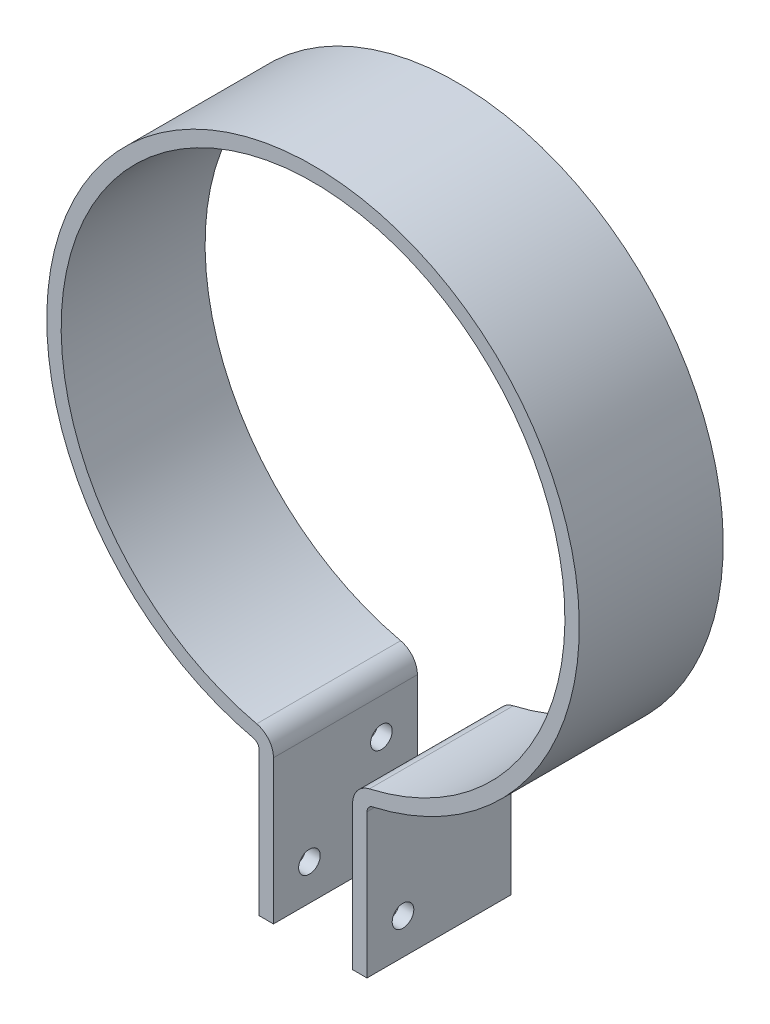
ISO-10303-21;
HEADER;
FILE_DESCRIPTION(('STEP AP214'),'2;1');
FILE_NAME('part.step','',(''),(''),'','','');
FILE_SCHEMA(('AUTOMOTIVE_DESIGN { 1 0 10303 214 1 1 1 1 }'));
ENDSEC;
DATA;
#1=APPLICATION_CONTEXT('core data for automotive mechanical design processes');
#2=APPLICATION_PROTOCOL_DEFINITION('international standard','automotive_design',2000,#1);
#3=PRODUCT_CONTEXT('',#1,'mechanical');
#4=PRODUCT('Part','Part','',(#3));
#5=PRODUCT_RELATED_PRODUCT_CATEGORY('part','',(#4));
#6=PRODUCT_DEFINITION_FORMATION('','',#4);
#7=PRODUCT_DEFINITION_CONTEXT('part definition',#1,'design');
#8=PRODUCT_DEFINITION('design','',#6,#7);
#9=PRODUCT_DEFINITION_SHAPE('','',#8);
#10=(LENGTH_UNIT() NAMED_UNIT(*) SI_UNIT(.MILLI.,.METRE.));
#11=(NAMED_UNIT(*) PLANE_ANGLE_UNIT() SI_UNIT($,.RADIAN.));
#12=(NAMED_UNIT(*) SI_UNIT($,.STERADIAN.) SOLID_ANGLE_UNIT());
#13=UNCERTAINTY_MEASURE_WITH_UNIT(LENGTH_MEASURE(1.E-05),#10,'distance_accuracy_value','');
#14=(GEOMETRIC_REPRESENTATION_CONTEXT(3) GLOBAL_UNCERTAINTY_ASSIGNED_CONTEXT((#13)) GLOBAL_UNIT_ASSIGNED_CONTEXT((#10,
#11,#12)) REPRESENTATION_CONTEXT('',''));
#15=CARTESIAN_POINT('',(0.,0.,0.));
#16=DIRECTION('',(0.,0.,1.));
#17=DIRECTION('',(1.,0.,0.));
#18=AXIS2_PLACEMENT_3D('',#15,#16,#17);
#19=CARTESIAN_POINT('',(-8.5,-37.0371435183654,20.));
#20=DIRECTION('',(0.,0.,-1.));
#21=DIRECTION('',(-1.,0.,0.));
#22=AXIS2_PLACEMENT_3D('',#19,#20,#21);
#23=CYLINDRICAL_SURFACE('',#22,1.);
#24=CARTESIAN_POINT('',(-8.5,-37.0371435183654,0.));
#25=DIRECTION('',(0.,0.,-1.));
#26=DIRECTION('',(1.,0.,0.));
#27=AXIS2_PLACEMENT_3D('',#24,#25,#26);
#28=CIRCLE('',#27,1.);
#29=CARTESIAN_POINT('',(-8.27631578947369,-36.0624818468295,0.));
#30=VERTEX_POINT('',#29);
#31=CARTESIAN_POINT('',(-7.5,-37.0371435183654,0.));
#32=VERTEX_POINT('',#31);
#33=EDGE_CURVE('E152',#30,#32,#28,.T.);
#34=ORIENTED_EDGE('',*,*,#33,.T.);
#35=DIRECTION('',(0.,0.,-1.));
#36=VECTOR('',#35,1.);
#37=CARTESIAN_POINT('',(-7.5,-37.0371435183654,20.));
#38=LINE('',#37,#36);
#39=CARTESIAN_POINT('',(-7.5,-37.0371435183654,20.));
#40=VERTEX_POINT('',#39);
#41=EDGE_CURVE('E11',#40,#32,#38,.T.);
#42=ORIENTED_EDGE('',*,*,#41,.F.);
#43=CARTESIAN_POINT('',(-8.5,-37.0371435183654,20.));
#44=DIRECTION('',(0.,0.,-1.));
#45=DIRECTION('',(1.,0.,0.));
#46=AXIS2_PLACEMENT_3D('',#43,#44,#45);
#47=CIRCLE('',#46,1.);
#48=CARTESIAN_POINT('',(-8.27631578947369,-36.0624818468295,20.));
#49=VERTEX_POINT('',#48);
#50=EDGE_CURVE('E175',#49,#40,#47,.T.);
#51=ORIENTED_EDGE('',*,*,#50,.F.);
#52=DIRECTION('',(0.,0.,-1.));
#53=VECTOR('',#52,1.);
#54=CARTESIAN_POINT('',(-8.27631578947369,-36.0624818468295,20.));
#55=LINE('',#54,#53);
#56=EDGE_CURVE('E148',#49,#30,#55,.T.);
#57=ORIENTED_EDGE('',*,*,#56,.T.);
#58=EDGE_LOOP('',(#34,#42,#51,#57));
#59=FACE_BOUND('',#58,.T.);
#60=ADVANCED_FACE('F30',(#59),#23,.F.);
#61=CARTESIAN_POINT('',(-7.5,-57.0371435183655,20.));
#62=DIRECTION('',(1.,0.,0.));
#63=DIRECTION('',(0.,0.,-1.));
#64=AXIS2_PLACEMENT_3D('',#61,#62,#63);
#65=PLANE('',#64);
#66=CARTESIAN_POINT('',(-7.5,-42.0371435183655,5.));
#67=DIRECTION('',(-1.,0.,0.));
#68=DIRECTION('',(0.,0.,1.));
#69=AXIS2_PLACEMENT_3D('',#66,#67,#68);
#70=CIRCLE('',#69,1.5);
#71=CARTESIAN_POINT('',(-7.5,-42.0371435183655,6.5));
#72=VERTEX_POINT('',#71);
#73=EDGE_CURVE('E303',#72,#72,#70,.T.);
#74=ORIENTED_EDGE('',*,*,#73,.F.);
#75=EDGE_LOOP('',(#74));
#76=FACE_BOUND('',#75,.T.);
#77=CARTESIAN_POINT('',(-7.5,-52.0371435183655,15.));
#78=DIRECTION('',(-1.,0.,0.));
#79=DIRECTION('',(0.,0.,1.));
#80=AXIS2_PLACEMENT_3D('',#77,#78,#79);
#81=CIRCLE('',#80,1.5);
#82=CARTESIAN_POINT('',(-7.5,-52.0371435183655,16.5));
#83=VERTEX_POINT('',#82);
#84=EDGE_CURVE('E201',#83,#83,#81,.T.);
#85=ORIENTED_EDGE('',*,*,#84,.F.);
#86=EDGE_LOOP('',(#85));
#87=FACE_BOUND('',#86,.T.);
#88=DIRECTION('',(0.,-1.,0.));
#89=VECTOR('',#88,1.);
#90=CARTESIAN_POINT('',(-7.5,-57.0371435183655,0.));
#91=LINE('',#90,#89);
#92=CARTESIAN_POINT('',(-7.5,-57.0371435183655,0.));
#93=VERTEX_POINT('',#92);
#94=EDGE_CURVE('E155',#32,#93,#91,.T.);
#95=ORIENTED_EDGE('',*,*,#94,.T.);
#96=DIRECTION('',(0.,0.,-1.));
#97=VECTOR('',#96,1.);
#98=CARTESIAN_POINT('',(-7.5,-57.0371435183655,20.));
#99=LINE('',#98,#97);
#100=CARTESIAN_POINT('',(-7.5,-57.0371435183655,20.));
#101=VERTEX_POINT('',#100);
#102=EDGE_CURVE('E39',#101,#93,#99,.T.);
#103=ORIENTED_EDGE('',*,*,#102,.F.);
#104=DIRECTION('',(0.,-1.,0.));
#105=VECTOR('',#104,1.);
#106=CARTESIAN_POINT('',(-7.5,-57.0371435183655,20.));
#107=LINE('',#106,#105);
#108=EDGE_CURVE('E103',#40,#101,#107,.T.);
#109=ORIENTED_EDGE('',*,*,#108,.F.);
#110=ORIENTED_EDGE('',*,*,#41,.T.);
#111=EDGE_LOOP('',(#95,#103,#109,#110));
#112=FACE_BOUND('',#111,.T.);
#113=ADVANCED_FACE('F259',(#76,#87,#112),#65,.F.);
#114=CARTESIAN_POINT('',(-7.5,-57.0371435183655,20.));
#115=DIRECTION('',(0.,1.,0.));
#116=DIRECTION('',(-1.,0.,0.));
#117=AXIS2_PLACEMENT_3D('',#114,#115,#116);
#118=PLANE('',#117);
#119=DIRECTION('',(1.,0.,0.));
#120=VECTOR('',#119,1.);
#121=CARTESIAN_POINT('',(-7.5,-57.0371435183655,0.));
#122=LINE('',#121,#120);
#123=CARTESIAN_POINT('',(-5.5,-57.0371435183654,0.));
#124=VERTEX_POINT('',#123);
#125=EDGE_CURVE('E158',#93,#124,#122,.T.);
#126=ORIENTED_EDGE('',*,*,#125,.T.);
#127=DIRECTION('',(0.,0.,-1.));
#128=VECTOR('',#127,1.);
#129=CARTESIAN_POINT('',(-5.5,-57.0371435183654,20.));
#130=LINE('',#129,#128);
#131=CARTESIAN_POINT('',(-5.5,-57.0371435183654,20.));
#132=VERTEX_POINT('',#131);
#133=EDGE_CURVE('E194',#132,#124,#130,.T.);
#134=ORIENTED_EDGE('',*,*,#133,.F.);
#135=DIRECTION('',(1.,0.,0.));
#136=VECTOR('',#135,1.);
#137=CARTESIAN_POINT('',(-7.5,-57.0371435183655,20.));
#138=LINE('',#137,#136);
#139=EDGE_CURVE('E220',#101,#132,#138,.T.);
#140=ORIENTED_EDGE('',*,*,#139,.F.);
#141=ORIENTED_EDGE('',*,*,#102,.T.);
#142=EDGE_LOOP('',(#126,#134,#140,#141));
#143=FACE_BOUND('',#142,.T.);
#144=ADVANCED_FACE('F264',(#143),#118,.F.);
#145=CARTESIAN_POINT('',(-5.5,-57.0371435183654,20.));
#146=DIRECTION('',(-1.,0.,0.));
#147=DIRECTION('',(0.,0.,1.));
#148=AXIS2_PLACEMENT_3D('',#145,#146,#147);
#149=PLANE('',#148);
#150=CARTESIAN_POINT('',(-5.5,-42.0371435183655,5.));
#151=DIRECTION('',(-1.,0.,0.));
#152=DIRECTION('',(0.,0.,1.));
#153=AXIS2_PLACEMENT_3D('',#150,#151,#152);
#154=CIRCLE('',#153,1.5);
#155=CARTESIAN_POINT('',(-5.5,-42.0371435183655,6.5));
#156=VERTEX_POINT('',#155);
#157=EDGE_CURVE('E207',#156,#156,#154,.T.);
#158=ORIENTED_EDGE('',*,*,#157,.T.);
#159=EDGE_LOOP('',(#158));
#160=FACE_BOUND('',#159,.T.);
#161=CARTESIAN_POINT('',(-5.5,-52.0371435183655,15.));
#162=DIRECTION('',(-1.,0.,0.));
#163=DIRECTION('',(0.,0.,1.));
#164=AXIS2_PLACEMENT_3D('',#161,#162,#163);
#165=CIRCLE('',#164,1.5);
#166=CARTESIAN_POINT('',(-5.5,-52.0371435183655,16.5));
#167=VERTEX_POINT('',#166);
#168=EDGE_CURVE('E156',#167,#167,#165,.T.);
#169=ORIENTED_EDGE('',*,*,#168,.T.);
#170=EDGE_LOOP('',(#169));
#171=FACE_BOUND('',#170,.T.);
#172=DIRECTION('',(0.,1.,0.));
#173=VECTOR('',#172,1.);
#174=CARTESIAN_POINT('',(-5.5,-57.0371435183654,0.));
#175=LINE('',#174,#173);
#176=CARTESIAN_POINT('',(-5.5,-37.0371435183654,0.));
#177=VERTEX_POINT('',#176);
#178=EDGE_CURVE('E160',#124,#177,#175,.T.);
#179=ORIENTED_EDGE('',*,*,#178,.T.);
#180=DIRECTION('',(0.,0.,-1.));
#181=VECTOR('',#180,1.);
#182=CARTESIAN_POINT('',(-5.5,-37.0371435183654,20.));
#183=LINE('',#182,#181);
#184=CARTESIAN_POINT('',(-5.5,-37.0371435183654,20.));
#185=VERTEX_POINT('',#184);
#186=EDGE_CURVE('E191',#185,#177,#183,.T.);
#187=ORIENTED_EDGE('',*,*,#186,.F.);
#188=DIRECTION('',(0.,1.,0.));
#189=VECTOR('',#188,1.);
#190=CARTESIAN_POINT('',(-5.5,-57.0371435183654,20.));
#191=LINE('',#190,#189);
#192=EDGE_CURVE('E222',#132,#185,#191,.T.);
#193=ORIENTED_EDGE('',*,*,#192,.F.);
#194=ORIENTED_EDGE('',*,*,#133,.T.);
#195=EDGE_LOOP('',(#179,#187,#193,#194));
#196=FACE_BOUND('',#195,.T.);
#197=ADVANCED_FACE('F270',(#160,#171,#196),#149,.F.);
#198=CARTESIAN_POINT('',(-8.5,-37.0371435183654,20.));
#199=DIRECTION('',(0.,0.,-1.));
#200=DIRECTION('',(-1.,0.,0.));
#201=AXIS2_PLACEMENT_3D('',#198,#199,#200);
#202=CYLINDRICAL_SURFACE('',#201,2.99999999999999);
#203=CARTESIAN_POINT('',(-8.5,-37.0371435183654,0.));
#204=DIRECTION('',(0.,0.,1.));
#205=DIRECTION('',(1.,0.,0.));
#206=AXIS2_PLACEMENT_3D('',#203,#204,#205);
#207=CIRCLE('',#206,2.99999999999999);
#208=CARTESIAN_POINT('',(-7.82894736842105,-34.1131585037577,0.));
#209=VERTEX_POINT('',#208);
#210=EDGE_CURVE('E162',#177,#209,#207,.T.);
#211=ORIENTED_EDGE('',*,*,#210,.T.);
#212=DIRECTION('',(0.,0.,-1.));
#213=VECTOR('',#212,1.);
#214=CARTESIAN_POINT('',(-7.82894736842105,-34.1131585037577,20.));
#215=LINE('',#214,#213);
#216=CARTESIAN_POINT('',(-7.82894736842105,-34.1131585037577,20.));
#217=VERTEX_POINT('',#216);
#218=EDGE_CURVE('E188',#217,#209,#215,.T.);
#219=ORIENTED_EDGE('',*,*,#218,.F.);
#220=CARTESIAN_POINT('',(-8.5,-37.0371435183654,20.));
#221=DIRECTION('',(0.,0.,1.));
#222=DIRECTION('',(1.,0.,0.));
#223=AXIS2_PLACEMENT_3D('',#220,#221,#222);
#224=CIRCLE('',#223,2.99999999999999);
#225=EDGE_CURVE('E224',#185,#217,#224,.T.);
#226=ORIENTED_EDGE('',*,*,#225,.F.);
#227=ORIENTED_EDGE('',*,*,#186,.T.);
#228=EDGE_LOOP('',(#211,#219,#226,#227));
#229=FACE_BOUND('',#228,.T.);
#230=ADVANCED_FACE('F277',(#229),#202,.T.);
#231=CARTESIAN_POINT('',(0.,0.,20.));
#232=DIRECTION('',(0.,0.,-1.));
#233=DIRECTION('',(-1.,0.,0.));
#234=AXIS2_PLACEMENT_3D('',#231,#232,#233);
#235=CYLINDRICAL_SURFACE('',#234,35.);
#236=CARTESIAN_POINT('',(0.,0.,0.));
#237=DIRECTION('',(0.,0.,-1.));
#238=DIRECTION('',(1.,0.,0.));
#239=AXIS2_PLACEMENT_3D('',#236,#237,#238);
#240=CIRCLE('',#239,35.);
#241=CARTESIAN_POINT('',(7.82894736842105,-34.1131585037577,0.));
#242=VERTEX_POINT('',#241);
#243=EDGE_CURVE('E164',#209,#242,#240,.T.);
#244=ORIENTED_EDGE('',*,*,#243,.T.);
#245=DIRECTION('',(0.,0.,-1.));
#246=VECTOR('',#245,1.);
#247=CARTESIAN_POINT('',(7.82894736842105,-34.1131585037577,20.));
#248=LINE('',#247,#246);
#249=CARTESIAN_POINT('',(7.82894736842105,-34.1131585037577,20.));
#250=VERTEX_POINT('',#249);
#251=EDGE_CURVE('E185',#250,#242,#248,.T.);
#252=ORIENTED_EDGE('',*,*,#251,.F.);
#253=CARTESIAN_POINT('',(0.,0.,20.));
#254=DIRECTION('',(0.,0.,-1.));
#255=DIRECTION('',(1.,0.,0.));
#256=AXIS2_PLACEMENT_3D('',#253,#254,#255);
#257=CIRCLE('',#256,35.);
#258=EDGE_CURVE('E226',#217,#250,#257,.T.);
#259=ORIENTED_EDGE('',*,*,#258,.F.);
#260=ORIENTED_EDGE('',*,*,#218,.T.);
#261=EDGE_LOOP('',(#244,#252,#259,#260));
#262=FACE_BOUND('',#261,.T.);
#263=ADVANCED_FACE('F281',(#262),#235,.F.);
#264=CARTESIAN_POINT('',(8.5,-37.0371435183654,20.));
#265=DIRECTION('',(0.,0.,-1.));
#266=DIRECTION('',(-1.,0.,0.));
#267=AXIS2_PLACEMENT_3D('',#264,#265,#266);
#268=CYLINDRICAL_SURFACE('',#267,3.);
#269=CARTESIAN_POINT('',(8.5,-37.0371435183654,0.));
#270=DIRECTION('',(0.,0.,1.));
#271=DIRECTION('',(1.,0.,0.));
#272=AXIS2_PLACEMENT_3D('',#269,#270,#271);
#273=CIRCLE('',#272,3.);
#274=CARTESIAN_POINT('',(5.5,-37.0371435183654,0.));
#275=VERTEX_POINT('',#274);
#276=EDGE_CURVE('E166',#242,#275,#273,.T.);
#277=ORIENTED_EDGE('',*,*,#276,.T.);
#278=DIRECTION('',(0.,0.,-1.));
#279=VECTOR('',#278,1.);
#280=CARTESIAN_POINT('',(5.5,-37.0371435183654,20.));
#281=LINE('',#280,#279);
#282=CARTESIAN_POINT('',(5.5,-37.0371435183654,20.));
#283=VERTEX_POINT('',#282);
#284=EDGE_CURVE('E182',#283,#275,#281,.T.);
#285=ORIENTED_EDGE('',*,*,#284,.F.);
#286=CARTESIAN_POINT('',(8.5,-37.0371435183654,20.));
#287=DIRECTION('',(0.,0.,1.));
#288=DIRECTION('',(1.,0.,0.));
#289=AXIS2_PLACEMENT_3D('',#286,#287,#288);
#290=CIRCLE('',#289,3.);
#291=EDGE_CURVE('E228',#250,#283,#290,.T.);
#292=ORIENTED_EDGE('',*,*,#291,.F.);
#293=ORIENTED_EDGE('',*,*,#251,.T.);
#294=EDGE_LOOP('',(#277,#285,#292,#293));
#295=FACE_BOUND('',#294,.T.);
#296=ADVANCED_FACE('F285',(#295),#268,.T.);
#297=CARTESIAN_POINT('',(5.5,-57.0371435183654,20.));
#298=DIRECTION('',(1.,0.,0.));
#299=DIRECTION('',(0.,1.,0.));
#300=AXIS2_PLACEMENT_3D('',#297,#298,#299);
#301=PLANE('',#300);
#302=CARTESIAN_POINT('',(5.5,-42.0371435183655,5.));
#303=DIRECTION('',(1.,0.,0.));
#304=DIRECTION('',(0.,1.,0.));
#305=AXIS2_PLACEMENT_3D('',#302,#303,#304);
#306=CIRCLE('',#305,1.5);
#307=CARTESIAN_POINT('',(5.5,-40.5371435183655,5.));
#308=VERTEX_POINT('',#307);
#309=EDGE_CURVE('E212',#308,#308,#306,.T.);
#310=ORIENTED_EDGE('',*,*,#309,.T.);
#311=EDGE_LOOP('',(#310));
#312=FACE_BOUND('',#311,.T.);
#313=CARTESIAN_POINT('',(5.5,-52.0371435183655,15.));
#314=DIRECTION('',(1.,0.,0.));
#315=DIRECTION('',(0.,1.,0.));
#316=AXIS2_PLACEMENT_3D('',#313,#314,#315);
#317=CIRCLE('',#316,1.5);
#318=CARTESIAN_POINT('',(5.5,-50.5371435183655,15.));
#319=VERTEX_POINT('',#318);
#320=EDGE_CURVE('E200',#319,#319,#317,.T.);
#321=ORIENTED_EDGE('',*,*,#320,.T.);
#322=EDGE_LOOP('',(#321));
#323=FACE_BOUND('',#322,.T.);
#324=DIRECTION('',(0.,-1.,0.));
#325=VECTOR('',#324,1.);
#326=CARTESIAN_POINT('',(5.5,-57.0371435183654,0.));
#327=LINE('',#326,#325);
#328=CARTESIAN_POINT('',(5.5,-57.0371435183654,0.));
#329=VERTEX_POINT('',#328);
#330=EDGE_CURVE('E168',#275,#329,#327,.T.);
#331=ORIENTED_EDGE('',*,*,#330,.T.);
#332=DIRECTION('',(0.,0.,-1.));
#333=VECTOR('',#332,1.);
#334=CARTESIAN_POINT('',(5.5,-57.0371435183654,20.));
#335=LINE('',#334,#333);
#336=CARTESIAN_POINT('',(5.5,-57.0371435183654,20.));
#337=VERTEX_POINT('',#336);
#338=EDGE_CURVE('E179',#337,#329,#335,.T.);
#339=ORIENTED_EDGE('',*,*,#338,.F.);
#340=DIRECTION('',(0.,-1.,0.));
#341=VECTOR('',#340,1.);
#342=CARTESIAN_POINT('',(5.5,-57.0371435183654,20.));
#343=LINE('',#342,#341);
#344=EDGE_CURVE('E230',#283,#337,#343,.T.);
#345=ORIENTED_EDGE('',*,*,#344,.F.);
#346=ORIENTED_EDGE('',*,*,#284,.T.);
#347=EDGE_LOOP('',(#331,#339,#345,#346));
#348=FACE_BOUND('',#347,.T.);
#349=ADVANCED_FACE('F236',(#312,#323,#348),#301,.F.);
#350=CARTESIAN_POINT('',(5.5,-57.0371435183654,20.));
#351=DIRECTION('',(0.,1.,0.));
#352=DIRECTION('',(-1.,0.,0.));
#353=AXIS2_PLACEMENT_3D('',#350,#351,#352);
#354=PLANE('',#353);
#355=DIRECTION('',(1.,0.,0.));
#356=VECTOR('',#355,1.);
#357=CARTESIAN_POINT('',(5.5,-57.0371435183654,0.));
#358=LINE('',#357,#356);
#359=CARTESIAN_POINT('',(7.5,-57.0371435183655,0.));
#360=VERTEX_POINT('',#359);
#361=EDGE_CURVE('E170',#329,#360,#358,.T.);
#362=ORIENTED_EDGE('',*,*,#361,.T.);
#363=DIRECTION('',(0.,0.,-1.));
#364=VECTOR('',#363,1.);
#365=CARTESIAN_POINT('',(7.5,-57.0371435183655,20.));
#366=LINE('',#365,#364);
#367=CARTESIAN_POINT('',(7.5,-57.0371435183655,20.));
#368=VERTEX_POINT('',#367);
#369=EDGE_CURVE('E143',#368,#360,#366,.T.);
#370=ORIENTED_EDGE('',*,*,#369,.F.);
#371=DIRECTION('',(1.,0.,0.));
#372=VECTOR('',#371,1.);
#373=CARTESIAN_POINT('',(5.5,-57.0371435183654,20.));
#374=LINE('',#373,#372);
#375=EDGE_CURVE('E134',#337,#368,#374,.T.);
#376=ORIENTED_EDGE('',*,*,#375,.F.);
#377=ORIENTED_EDGE('',*,*,#338,.T.);
#378=EDGE_LOOP('',(#362,#370,#376,#377));
#379=FACE_BOUND('',#378,.T.);
#380=ADVANCED_FACE('F240',(#379),#354,.F.);
#381=CARTESIAN_POINT('',(7.5,-57.0371435183655,20.));
#382=DIRECTION('',(-1.,0.,0.));
#383=DIRECTION('',(0.,0.,1.));
#384=AXIS2_PLACEMENT_3D('',#381,#382,#383);
#385=PLANE('',#384);
#386=CARTESIAN_POINT('',(7.5,-42.0371435183655,5.));
#387=DIRECTION('',(-1.,0.,0.));
#388=DIRECTION('',(0.,0.,1.));
#389=AXIS2_PLACEMENT_3D('',#386,#387,#388);
#390=CIRCLE('',#389,1.5);
#391=CARTESIAN_POINT('',(7.5,-42.0371435183655,6.5));
#392=VERTEX_POINT('',#391);
#393=EDGE_CURVE('E33',#392,#392,#390,.T.);
#394=ORIENTED_EDGE('',*,*,#393,.T.);
#395=EDGE_LOOP('',(#394));
#396=FACE_BOUND('',#395,.T.);
#397=CARTESIAN_POINT('',(7.5,-52.0371435183655,15.));
#398=DIRECTION('',(-1.,0.,0.));
#399=DIRECTION('',(0.,0.,1.));
#400=AXIS2_PLACEMENT_3D('',#397,#398,#399);
#401=CIRCLE('',#400,1.5);
#402=CARTESIAN_POINT('',(7.5,-52.0371435183655,16.5));
#403=VERTEX_POINT('',#402);
#404=EDGE_CURVE('E198',#403,#403,#401,.T.);
#405=ORIENTED_EDGE('',*,*,#404,.T.);
#406=EDGE_LOOP('',(#405));
#407=FACE_BOUND('',#406,.T.);
#408=DIRECTION('',(0.,1.,0.));
#409=VECTOR('',#408,1.);
#410=CARTESIAN_POINT('',(7.5,-57.0371435183655,0.));
#411=LINE('',#410,#409);
#412=CARTESIAN_POINT('',(7.5,-37.0371435183655,0.));
#413=VERTEX_POINT('',#412);
#414=EDGE_CURVE('E142',#360,#413,#411,.T.);
#415=ORIENTED_EDGE('',*,*,#414,.T.);
#416=DIRECTION('',(0.,0.,-1.));
#417=VECTOR('',#416,1.);
#418=CARTESIAN_POINT('',(7.5,-37.0371435183655,20.));
#419=LINE('',#418,#417);
#420=CARTESIAN_POINT('',(7.5,-37.0371435183655,20.));
#421=VERTEX_POINT('',#420);
#422=EDGE_CURVE('E139',#421,#413,#419,.T.);
#423=ORIENTED_EDGE('',*,*,#422,.F.);
#424=DIRECTION('',(0.,1.,0.));
#425=VECTOR('',#424,1.);
#426=CARTESIAN_POINT('',(7.5,-57.0371435183655,20.));
#427=LINE('',#426,#425);
#428=EDGE_CURVE('E128',#368,#421,#427,.T.);
#429=ORIENTED_EDGE('',*,*,#428,.F.);
#430=ORIENTED_EDGE('',*,*,#369,.T.);
#431=EDGE_LOOP('',(#415,#423,#429,#430));
#432=FACE_BOUND('',#431,.T.);
#433=ADVANCED_FACE('F140',(#396,#407,#432),#385,.F.);
#434=CARTESIAN_POINT('',(8.5,-37.0371435183655,20.));
#435=DIRECTION('',(0.,0.,-1.));
#436=DIRECTION('',(-1.,0.,0.));
#437=AXIS2_PLACEMENT_3D('',#434,#435,#436);
#438=CYLINDRICAL_SURFACE('',#437,1.00000000000001);
#439=CARTESIAN_POINT('',(8.5,-37.0371435183655,0.));
#440=DIRECTION('',(0.,0.,-1.));
#441=DIRECTION('',(1.,0.,0.));
#442=AXIS2_PLACEMENT_3D('',#439,#440,#441);
#443=CIRCLE('',#442,1.00000000000001);
#444=CARTESIAN_POINT('',(8.27631578947368,-36.0624818468295,0.));
#445=VERTEX_POINT('',#444);
#446=EDGE_CURVE('E89',#413,#445,#443,.T.);
#447=ORIENTED_EDGE('',*,*,#446,.T.);
#448=DIRECTION('',(0.,0.,-1.));
#449=VECTOR('',#448,1.);
#450=CARTESIAN_POINT('',(8.27631578947368,-36.0624818468295,20.));
#451=LINE('',#450,#449);
#452=CARTESIAN_POINT('',(8.27631578947368,-36.0624818468295,20.));
#453=VERTEX_POINT('',#452);
#454=EDGE_CURVE('E144',#453,#445,#451,.T.);
#455=ORIENTED_EDGE('',*,*,#454,.F.);
#456=CARTESIAN_POINT('',(8.5,-37.0371435183655,20.));
#457=DIRECTION('',(0.,0.,-1.));
#458=DIRECTION('',(1.,0.,0.));
#459=AXIS2_PLACEMENT_3D('',#456,#457,#458);
#460=CIRCLE('',#459,1.00000000000001);
#461=EDGE_CURVE('E132',#421,#453,#460,.T.);
#462=ORIENTED_EDGE('',*,*,#461,.F.);
#463=ORIENTED_EDGE('',*,*,#422,.T.);
#464=EDGE_LOOP('',(#447,#455,#462,#463));
#465=FACE_BOUND('',#464,.T.);
#466=ADVANCED_FACE('F146',(#465),#438,.F.);
#467=CARTESIAN_POINT('',(0.,0.,20.));
#468=DIRECTION('',(0.,0.,-1.));
#469=DIRECTION('',(-1.,0.,0.));
#470=AXIS2_PLACEMENT_3D('',#467,#468,#469);
#471=CYLINDRICAL_SURFACE('',#470,37.);
#472=CARTESIAN_POINT('',(0.,0.,0.));
#473=DIRECTION('',(0.,0.,1.));
#474=DIRECTION('',(1.,0.,0.));
#475=AXIS2_PLACEMENT_3D('',#472,#473,#474);
#476=CIRCLE('',#475,37.);
#477=EDGE_CURVE('E95',#445,#30,#476,.T.);
#478=ORIENTED_EDGE('',*,*,#477,.T.);
#479=ORIENTED_EDGE('',*,*,#56,.F.);
#480=CARTESIAN_POINT('',(0.,0.,20.));
#481=DIRECTION('',(0.,0.,1.));
#482=DIRECTION('',(1.,0.,0.));
#483=AXIS2_PLACEMENT_3D('',#480,#481,#482);
#484=CIRCLE('',#483,37.);
#485=EDGE_CURVE('E48',#453,#49,#484,.T.);
#486=ORIENTED_EDGE('',*,*,#485,.F.);
#487=ORIENTED_EDGE('',*,*,#454,.T.);
#488=EDGE_LOOP('',(#478,#479,#486,#487));
#489=FACE_BOUND('',#488,.T.);
#490=ADVANCED_FACE('F248',(#489),#471,.T.);
#491=CARTESIAN_POINT('',(-8.5,-37.0371435183654,20.));
#492=DIRECTION('',(0.,0.,1.));
#493=DIRECTION('',(1.,0.,0.));
#494=AXIS2_PLACEMENT_3D('',#491,#492,#493);
#495=PLANE('',#494);
#496=ORIENTED_EDGE('',*,*,#50,.T.);
#497=ORIENTED_EDGE('',*,*,#108,.T.);
#498=ORIENTED_EDGE('',*,*,#139,.T.);
#499=ORIENTED_EDGE('',*,*,#192,.T.);
#500=ORIENTED_EDGE('',*,*,#225,.T.);
#501=ORIENTED_EDGE('',*,*,#258,.T.);
#502=ORIENTED_EDGE('',*,*,#291,.T.);
#503=ORIENTED_EDGE('',*,*,#344,.T.);
#504=ORIENTED_EDGE('',*,*,#375,.T.);
#505=ORIENTED_EDGE('',*,*,#428,.T.);
#506=ORIENTED_EDGE('',*,*,#461,.T.);
#507=ORIENTED_EDGE('',*,*,#485,.T.);
#508=EDGE_LOOP('',(#496,#497,#498,#499,#500,#501,#502,#503,#504,#505,#506,#507));
#509=FACE_BOUND('',#508,.T.);
#510=ADVANCED_FACE('F130',(#509),#495,.T.);
#511=CARTESIAN_POINT('',(-8.5,-37.0371435183654,0.));
#512=DIRECTION('',(0.,0.,1.));
#513=DIRECTION('',(1.,0.,0.));
#514=AXIS2_PLACEMENT_3D('',#511,#512,#513);
#515=PLANE('',#514);
#516=ORIENTED_EDGE('',*,*,#33,.F.);
#517=ORIENTED_EDGE('',*,*,#477,.F.);
#518=ORIENTED_EDGE('',*,*,#446,.F.);
#519=ORIENTED_EDGE('',*,*,#414,.F.);
#520=ORIENTED_EDGE('',*,*,#361,.F.);
#521=ORIENTED_EDGE('',*,*,#330,.F.);
#522=ORIENTED_EDGE('',*,*,#276,.F.);
#523=ORIENTED_EDGE('',*,*,#243,.F.);
#524=ORIENTED_EDGE('',*,*,#210,.F.);
#525=ORIENTED_EDGE('',*,*,#178,.F.);
#526=ORIENTED_EDGE('',*,*,#125,.F.);
#527=ORIENTED_EDGE('',*,*,#94,.F.);
#528=EDGE_LOOP('',(#516,#517,#518,#519,#520,#521,#522,#523,#524,#525,#526,#527));
#529=FACE_BOUND('',#528,.T.);
#530=ADVANCED_FACE('F243',(#529),#515,.F.);
#531=CARTESIAN_POINT('',(37.,-52.0371435183655,15.));
#532=DIRECTION('',(-1.,0.,0.));
#533=DIRECTION('',(0.,0.,1.));
#534=AXIS2_PLACEMENT_3D('',#531,#532,#533);
#535=CYLINDRICAL_SURFACE('',#534,1.5);
#536=ORIENTED_EDGE('',*,*,#404,.F.);
#537=EDGE_LOOP('',(#536));
#538=FACE_BOUND('',#537,.T.);
#539=ORIENTED_EDGE('',*,*,#320,.F.);
#540=EDGE_LOOP('',(#539));
#541=FACE_BOUND('',#540,.T.);
#542=ADVANCED_FACE('F332',(#538,#541),#535,.F.);
#543=ORIENTED_EDGE('',*,*,#84,.T.);
#544=EDGE_LOOP('',(#543));
#545=FACE_BOUND('',#544,.T.);
#546=ORIENTED_EDGE('',*,*,#168,.F.);
#547=EDGE_LOOP('',(#546));
#548=FACE_BOUND('',#547,.T.);
#549=ADVANCED_FACE('F330',(#545,#548),#535,.F.);
#550=CARTESIAN_POINT('',(37.,-42.0371435183655,5.));
#551=DIRECTION('',(-1.,0.,0.));
#552=DIRECTION('',(0.,0.,1.));
#553=AXIS2_PLACEMENT_3D('',#550,#551,#552);
#554=CYLINDRICAL_SURFACE('',#553,1.5);
#555=ORIENTED_EDGE('',*,*,#393,.F.);
#556=EDGE_LOOP('',(#555));
#557=FACE_BOUND('',#556,.T.);
#558=ORIENTED_EDGE('',*,*,#309,.F.);
#559=EDGE_LOOP('',(#558));
#560=FACE_BOUND('',#559,.T.);
#561=ADVANCED_FACE('F311',(#557,#560),#554,.F.);
#562=ORIENTED_EDGE('',*,*,#73,.T.);
#563=EDGE_LOOP('',(#562));
#564=FACE_BOUND('',#563,.T.);
#565=ORIENTED_EDGE('',*,*,#157,.F.);
#566=EDGE_LOOP('',(#565));
#567=FACE_BOUND('',#566,.T.);
#568=ADVANCED_FACE('F308',(#564,#567),#554,.F.);
#569=CLOSED_SHELL('',(#60,#113,#144,#197,#230,#263,#296,#349,#380,#433,#466,#490,#510,#530,#542,
#549,#561,#568));
#570=MANIFOLD_SOLID_BREP('B2',#569);
#571=ADVANCED_BREP_SHAPE_REPRESENTATION('',(#18,#570),#14);
#572=SHAPE_DEFINITION_REPRESENTATION(#9,#571);
ENDSEC;
END-ISO-10303-21;
